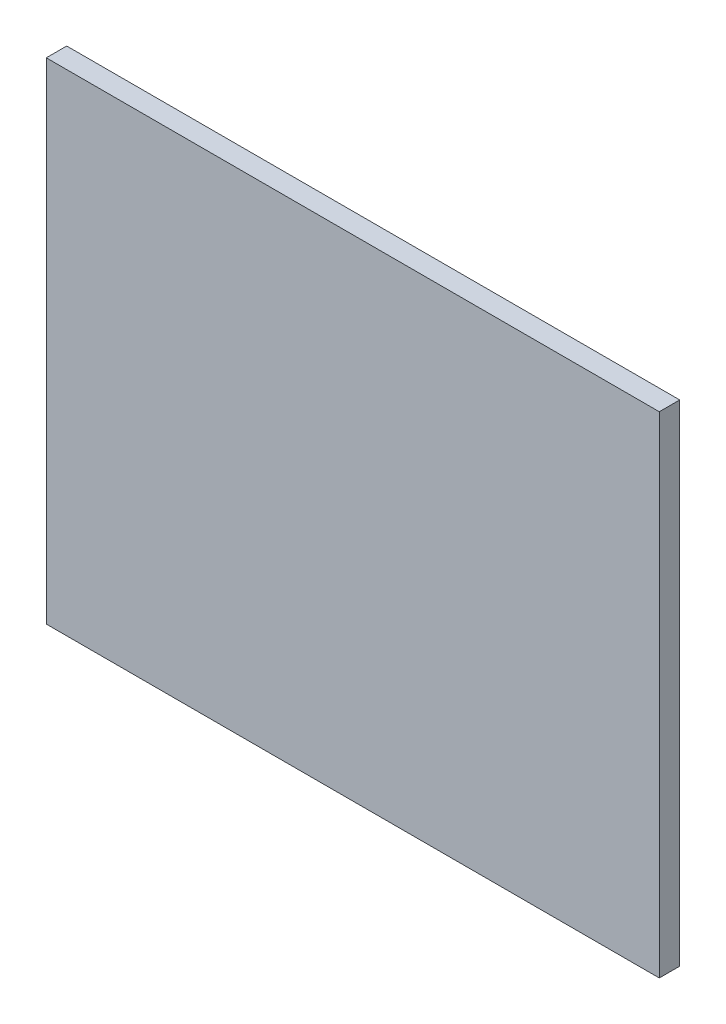
ISO-10303-21;
HEADER;
FILE_DESCRIPTION(('STEP AP214'),'2;1');
FILE_NAME('part.step','',(''),(''),'','','');
FILE_SCHEMA(('AUTOMOTIVE_DESIGN { 1 0 10303 214 1 1 1 1 }'));
ENDSEC;
DATA;
#1=APPLICATION_CONTEXT('core data for automotive mechanical design processes');
#2=APPLICATION_PROTOCOL_DEFINITION('international standard','automotive_design',2000,#1);
#3=PRODUCT_CONTEXT('',#1,'mechanical');
#4=PRODUCT('Part','Part','',(#3));
#5=PRODUCT_RELATED_PRODUCT_CATEGORY('part','',(#4));
#6=PRODUCT_DEFINITION_FORMATION('','',#4);
#7=PRODUCT_DEFINITION_CONTEXT('part definition',#1,'design');
#8=PRODUCT_DEFINITION('design','',#6,#7);
#9=PRODUCT_DEFINITION_SHAPE('','',#8);
#10=(LENGTH_UNIT() NAMED_UNIT(*) SI_UNIT(.MILLI.,.METRE.));
#11=(NAMED_UNIT(*) PLANE_ANGLE_UNIT() SI_UNIT($,.RADIAN.));
#12=(NAMED_UNIT(*) SI_UNIT($,.STERADIAN.) SOLID_ANGLE_UNIT());
#13=UNCERTAINTY_MEASURE_WITH_UNIT(LENGTH_MEASURE(1.E-05),#10,'distance_accuracy_value','');
#14=(GEOMETRIC_REPRESENTATION_CONTEXT(3) GLOBAL_UNCERTAINTY_ASSIGNED_CONTEXT((#13)) GLOBAL_UNIT_ASSIGNED_CONTEXT((#10,
#11,#12)) REPRESENTATION_CONTEXT('',''));
#15=CARTESIAN_POINT('',(0.,0.,0.));
#16=DIRECTION('',(0.,0.,1.));
#17=DIRECTION('',(1.,0.,0.));
#18=AXIS2_PLACEMENT_3D('',#15,#16,#17);
#19=CARTESIAN_POINT('',(-168.548344370861,-132.971523178808,12.7));
#20=DIRECTION('',(1.,0.,0.));
#21=DIRECTION('',(0.,0.,-1.));
#22=AXIS2_PLACEMENT_3D('',#19,#20,#21);
#23=PLANE('',#22);
#24=DIRECTION('',(0.,-1.,0.));
#25=VECTOR('',#24,1.);
#26=CARTESIAN_POINT('',(-168.548344370861,-132.971523178808,0.));
#27=LINE('',#26,#25);
#28=CARTESIAN_POINT('',(-168.548344370861,171.828476821192,0.));
#29=VERTEX_POINT('',#28);
#30=CARTESIAN_POINT('',(-168.548344370861,-132.971523178808,0.));
#31=VERTEX_POINT('',#30);
#32=EDGE_CURVE('E113',#29,#31,#27,.T.);
#33=ORIENTED_EDGE('',*,*,#32,.T.);
#34=DIRECTION('',(0.,0.,-1.));
#35=VECTOR('',#34,1.);
#36=CARTESIAN_POINT('',(-168.548344370861,-132.971523178808,12.7));
#37=LINE('',#36,#35);
#38=CARTESIAN_POINT('',(-168.548344370861,-132.971523178808,12.7));
#39=VERTEX_POINT('',#38);
#40=EDGE_CURVE('E11',#39,#31,#37,.T.);
#41=ORIENTED_EDGE('',*,*,#40,.F.);
#42=DIRECTION('',(0.,-1.,0.));
#43=VECTOR('',#42,1.);
#44=CARTESIAN_POINT('',(-168.548344370861,-132.971523178808,12.7));
#45=LINE('',#44,#43);
#46=CARTESIAN_POINT('',(-168.548344370861,171.828476821192,12.7));
#47=VERTEX_POINT('',#46);
#48=EDGE_CURVE('E97',#47,#39,#45,.T.);
#49=ORIENTED_EDGE('',*,*,#48,.F.);
#50=DIRECTION('',(0.,0.,-1.));
#51=VECTOR('',#50,1.);
#52=CARTESIAN_POINT('',(-168.548344370861,171.828476821192,12.7));
#53=LINE('',#52,#51);
#54=EDGE_CURVE('E109',#47,#29,#53,.T.);
#55=ORIENTED_EDGE('',*,*,#54,.T.);
#56=EDGE_LOOP('',(#33,#41,#49,#55));
#57=FACE_BOUND('',#56,.T.);
#58=ADVANCED_FACE('F45',(#57),#23,.F.);
#59=CARTESIAN_POINT('',(-168.548344370861,-132.971523178808,12.7));
#60=DIRECTION('',(0.,1.,0.));
#61=DIRECTION('',(0.,0.,1.));
#62=AXIS2_PLACEMENT_3D('',#59,#60,#61);
#63=PLANE('',#62);
#64=DIRECTION('',(1.,0.,0.));
#65=VECTOR('',#64,1.);
#66=CARTESIAN_POINT('',(-168.548344370861,-132.971523178808,0.));
#67=LINE('',#66,#65);
#68=CARTESIAN_POINT('',(212.451655629139,-132.971523178808,0.));
#69=VERTEX_POINT('',#68);
#70=EDGE_CURVE('E102',#31,#69,#67,.T.);
#71=ORIENTED_EDGE('',*,*,#70,.T.);
#72=DIRECTION('',(0.,0.,-1.));
#73=VECTOR('',#72,1.);
#74=CARTESIAN_POINT('',(212.451655629139,-132.971523178808,12.7));
#75=LINE('',#74,#73);
#76=CARTESIAN_POINT('',(212.451655629139,-132.971523178808,12.7));
#77=VERTEX_POINT('',#76);
#78=EDGE_CURVE('E54',#77,#69,#75,.T.);
#79=ORIENTED_EDGE('',*,*,#78,.F.);
#80=DIRECTION('',(1.,0.,0.));
#81=VECTOR('',#80,1.);
#82=CARTESIAN_POINT('',(-168.548344370861,-132.971523178808,12.7));
#83=LINE('',#82,#81);
#84=EDGE_CURVE('E92',#39,#77,#83,.T.);
#85=ORIENTED_EDGE('',*,*,#84,.F.);
#86=ORIENTED_EDGE('',*,*,#40,.T.);
#87=EDGE_LOOP('',(#71,#79,#85,#86));
#88=FACE_BOUND('',#87,.T.);
#89=ADVANCED_FACE('F101',(#88),#63,.F.);
#90=CARTESIAN_POINT('',(212.451655629139,-132.971523178808,12.7));
#91=DIRECTION('',(-1.,0.,0.));
#92=DIRECTION('',(0.,0.,1.));
#93=AXIS2_PLACEMENT_3D('',#90,#91,#92);
#94=PLANE('',#93);
#95=DIRECTION('',(0.,1.,0.));
#96=VECTOR('',#95,1.);
#97=CARTESIAN_POINT('',(212.451655629139,-132.971523178808,0.));
#98=LINE('',#97,#96);
#99=CARTESIAN_POINT('',(212.451655629139,171.828476821192,0.));
#100=VERTEX_POINT('',#99);
#101=EDGE_CURVE('E79',#69,#100,#98,.T.);
#102=ORIENTED_EDGE('',*,*,#101,.T.);
#103=DIRECTION('',(0.,0.,-1.));
#104=VECTOR('',#103,1.);
#105=CARTESIAN_POINT('',(212.451655629139,171.828476821192,12.7));
#106=LINE('',#105,#104);
#107=CARTESIAN_POINT('',(212.451655629139,171.828476821192,12.7));
#108=VERTEX_POINT('',#107);
#109=EDGE_CURVE('E104',#108,#100,#106,.T.);
#110=ORIENTED_EDGE('',*,*,#109,.F.);
#111=DIRECTION('',(0.,1.,0.));
#112=VECTOR('',#111,1.);
#113=CARTESIAN_POINT('',(212.451655629139,-132.971523178808,12.7));
#114=LINE('',#113,#112);
#115=EDGE_CURVE('E95',#77,#108,#114,.T.);
#116=ORIENTED_EDGE('',*,*,#115,.F.);
#117=ORIENTED_EDGE('',*,*,#78,.T.);
#118=EDGE_LOOP('',(#102,#110,#116,#117));
#119=FACE_BOUND('',#118,.T.);
#120=ADVANCED_FACE('F105',(#119),#94,.F.);
#121=CARTESIAN_POINT('',(-168.548344370861,171.828476821192,12.7));
#122=DIRECTION('',(0.,-1.,0.));
#123=DIRECTION('',(0.,0.,-1.));
#124=AXIS2_PLACEMENT_3D('',#121,#122,#123);
#125=PLANE('',#124);
#126=DIRECTION('',(-1.,0.,0.));
#127=VECTOR('',#126,1.);
#128=CARTESIAN_POINT('',(-168.548344370861,171.828476821192,0.));
#129=LINE('',#128,#127);
#130=EDGE_CURVE('E85',#100,#29,#129,.T.);
#131=ORIENTED_EDGE('',*,*,#130,.T.);
#132=ORIENTED_EDGE('',*,*,#54,.F.);
#133=DIRECTION('',(-1.,0.,0.));
#134=VECTOR('',#133,1.);
#135=CARTESIAN_POINT('',(-168.548344370861,171.828476821192,12.7));
#136=LINE('',#135,#134);
#137=EDGE_CURVE('E62',#108,#47,#136,.T.);
#138=ORIENTED_EDGE('',*,*,#137,.F.);
#139=ORIENTED_EDGE('',*,*,#109,.T.);
#140=EDGE_LOOP('',(#131,#132,#138,#139));
#141=FACE_BOUND('',#140,.T.);
#142=ADVANCED_FACE('F126',(#141),#125,.F.);
#143=CARTESIAN_POINT('',(0.,0.,12.7));
#144=DIRECTION('',(0.,0.,-1.));
#145=DIRECTION('',(-1.,0.,0.));
#146=AXIS2_PLACEMENT_3D('',#143,#144,#145);
#147=PLANE('',#146);
#148=ORIENTED_EDGE('',*,*,#48,.T.);
#149=ORIENTED_EDGE('',*,*,#84,.T.);
#150=ORIENTED_EDGE('',*,*,#115,.T.);
#151=ORIENTED_EDGE('',*,*,#137,.T.);
#152=EDGE_LOOP('',(#148,#149,#150,#151));
#153=FACE_BOUND('',#152,.T.);
#154=ADVANCED_FACE('F93',(#153),#147,.F.);
#155=CARTESIAN_POINT('',(0.,0.,0.));
#156=DIRECTION('',(0.,0.,-1.));
#157=DIRECTION('',(-1.,0.,0.));
#158=AXIS2_PLACEMENT_3D('',#155,#156,#157);
#159=PLANE('',#158);
#160=ORIENTED_EDGE('',*,*,#32,.F.);
#161=ORIENTED_EDGE('',*,*,#130,.F.);
#162=ORIENTED_EDGE('',*,*,#101,.F.);
#163=ORIENTED_EDGE('',*,*,#70,.F.);
#164=EDGE_LOOP('',(#160,#161,#162,#163));
#165=FACE_BOUND('',#164,.T.);
#166=ADVANCED_FACE('F129',(#165),#159,.T.);
#167=CLOSED_SHELL('',(#58,#89,#120,#142,#154,#166));
#168=MANIFOLD_SOLID_BREP('B2',#167);
#169=ADVANCED_BREP_SHAPE_REPRESENTATION('',(#18,#168),#14);
#170=SHAPE_DEFINITION_REPRESENTATION(#9,#169);
ENDSEC;
END-ISO-10303-21;
